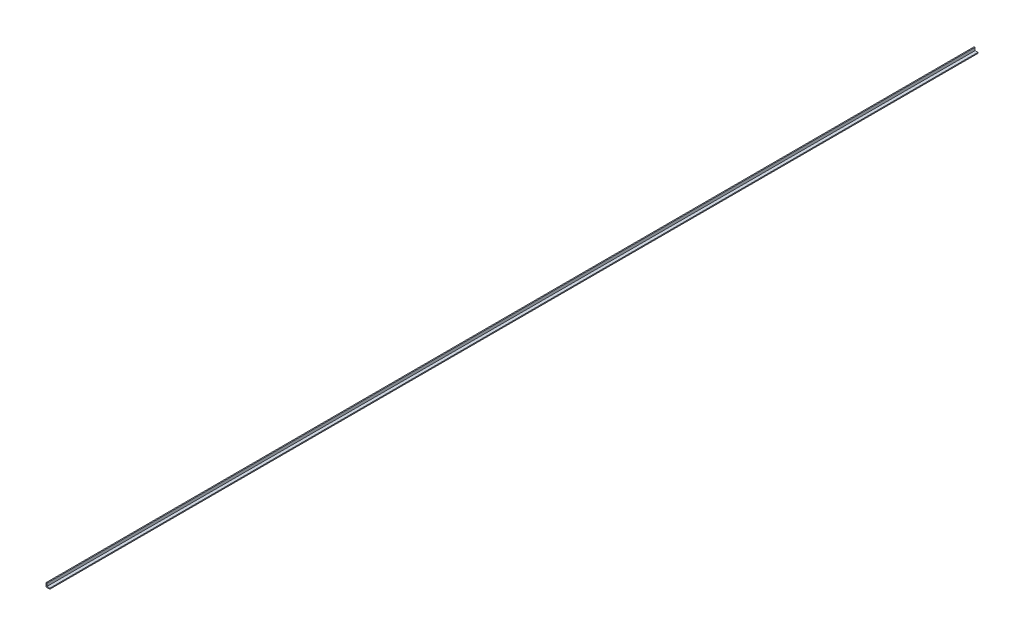
ISO-10303-21;
HEADER;
FILE_DESCRIPTION(('STEP AP214'),'2;1');
FILE_NAME('part.step','',(''),(''),'','','');
FILE_SCHEMA(('AUTOMOTIVE_DESIGN { 1 0 10303 214 1 1 1 1 }'));
ENDSEC;
DATA;
#1=APPLICATION_CONTEXT('core data for automotive mechanical design processes');
#2=APPLICATION_PROTOCOL_DEFINITION('international standard','automotive_design',2000,#1);
#3=PRODUCT_CONTEXT('',#1,'mechanical');
#4=PRODUCT('Part','Part','',(#3));
#5=PRODUCT_RELATED_PRODUCT_CATEGORY('part','',(#4));
#6=PRODUCT_DEFINITION_FORMATION('','',#4);
#7=PRODUCT_DEFINITION_CONTEXT('part definition',#1,'design');
#8=PRODUCT_DEFINITION('design','',#6,#7);
#9=PRODUCT_DEFINITION_SHAPE('','',#8);
#10=(LENGTH_UNIT() NAMED_UNIT(*) SI_UNIT(.MILLI.,.METRE.));
#11=(NAMED_UNIT(*) PLANE_ANGLE_UNIT() SI_UNIT($,.RADIAN.));
#12=(NAMED_UNIT(*) SI_UNIT($,.STERADIAN.) SOLID_ANGLE_UNIT());
#13=UNCERTAINTY_MEASURE_WITH_UNIT(LENGTH_MEASURE(1.E-05),#10,'distance_accuracy_value','');
#14=(GEOMETRIC_REPRESENTATION_CONTEXT(3) GLOBAL_UNCERTAINTY_ASSIGNED_CONTEXT((#13)) GLOBAL_UNIT_ASSIGNED_CONTEXT((#10,
#11,#12)) REPRESENTATION_CONTEXT('',''));
#15=CARTESIAN_POINT('',(0.,0.,0.));
#16=DIRECTION('',(0.,0.,1.));
#17=DIRECTION('',(1.,0.,0.));
#18=AXIS2_PLACEMENT_3D('',#15,#16,#17);
#19=CARTESIAN_POINT('',(6.35,25.4,-6100.));
#20=DIRECTION('',(0.,1.,0.));
#21=DIRECTION('',(0.,0.,1.));
#22=AXIS2_PLACEMENT_3D('',#19,#20,#21);
#23=PLANE('',#22);
#24=DIRECTION('',(-1.,0.,0.));
#25=VECTOR('',#24,1.);
#26=CARTESIAN_POINT('',(6.35,25.4,0.));
#27=LINE('',#26,#25);
#28=CARTESIAN_POINT('',(6.35,25.4,0.));
#29=VERTEX_POINT('',#28);
#30=CARTESIAN_POINT('',(0.,25.4,0.));
#31=VERTEX_POINT('',#30);
#32=EDGE_CURVE('E118',#29,#31,#27,.T.);
#33=ORIENTED_EDGE('',*,*,#32,.F.);
#34=DIRECTION('',(0.,0.,1.));
#35=VECTOR('',#34,1.);
#36=CARTESIAN_POINT('',(6.35,25.4,-6100.));
#37=LINE('',#36,#35);
#38=CARTESIAN_POINT('',(6.35,25.4,-6100.));
#39=VERTEX_POINT('',#38);
#40=EDGE_CURVE('E11',#39,#29,#37,.T.);
#41=ORIENTED_EDGE('',*,*,#40,.F.);
#42=DIRECTION('',(-1.,0.,0.));
#43=VECTOR('',#42,1.);
#44=CARTESIAN_POINT('',(6.35,25.4,-6100.));
#45=LINE('',#44,#43);
#46=CARTESIAN_POINT('',(0.,25.4,-6100.));
#47=VERTEX_POINT('',#46);
#48=EDGE_CURVE('E132',#39,#47,#45,.T.);
#49=ORIENTED_EDGE('',*,*,#48,.T.);
#50=DIRECTION('',(0.,0.,1.));
#51=VECTOR('',#50,1.);
#52=CARTESIAN_POINT('',(0.,25.4,-6100.));
#53=LINE('',#52,#51);
#54=EDGE_CURVE('E36',#47,#31,#53,.T.);
#55=ORIENTED_EDGE('',*,*,#54,.T.);
#56=EDGE_LOOP('',(#33,#41,#49,#55));
#57=FACE_BOUND('',#56,.T.);
#58=ADVANCED_FACE('F33',(#57),#23,.T.);
#59=CARTESIAN_POINT('',(6.35,6.35,-6100.));
#60=DIRECTION('',(1.,0.,0.));
#61=DIRECTION('',(0.,1.,0.));
#62=AXIS2_PLACEMENT_3D('',#59,#60,#61);
#63=PLANE('',#62);
#64=DIRECTION('',(0.,1.,0.));
#65=VECTOR('',#64,1.);
#66=CARTESIAN_POINT('',(6.35,6.35,0.));
#67=LINE('',#66,#65);
#68=CARTESIAN_POINT('',(6.35,6.35,0.));
#69=VERTEX_POINT('',#68);
#70=EDGE_CURVE('E130',#69,#29,#67,.T.);
#71=ORIENTED_EDGE('',*,*,#70,.F.);
#72=DIRECTION('',(0.,0.,1.));
#73=VECTOR('',#72,1.);
#74=CARTESIAN_POINT('',(6.35,6.35,-6100.));
#75=LINE('',#74,#73);
#76=CARTESIAN_POINT('',(6.35,6.35,-6100.));
#77=VERTEX_POINT('',#76);
#78=EDGE_CURVE('E42',#77,#69,#75,.T.);
#79=ORIENTED_EDGE('',*,*,#78,.F.);
#80=DIRECTION('',(0.,1.,0.));
#81=VECTOR('',#80,1.);
#82=CARTESIAN_POINT('',(6.35,6.35,-6100.));
#83=LINE('',#82,#81);
#84=EDGE_CURVE('E108',#77,#39,#83,.T.);
#85=ORIENTED_EDGE('',*,*,#84,.T.);
#86=ORIENTED_EDGE('',*,*,#40,.T.);
#87=EDGE_LOOP('',(#71,#79,#85,#86));
#88=FACE_BOUND('',#87,.T.);
#89=ADVANCED_FACE('F140',(#88),#63,.T.);
#90=CARTESIAN_POINT('',(25.4,6.35,-6100.));
#91=DIRECTION('',(0.,1.,0.));
#92=DIRECTION('',(-1.,0.,0.));
#93=AXIS2_PLACEMENT_3D('',#90,#91,#92);
#94=PLANE('',#93);
#95=DIRECTION('',(-1.,0.,0.));
#96=VECTOR('',#95,1.);
#97=CARTESIAN_POINT('',(25.4,6.35,0.));
#98=LINE('',#97,#96);
#99=CARTESIAN_POINT('',(25.4,6.35,0.));
#100=VERTEX_POINT('',#99);
#101=EDGE_CURVE('E95',#100,#69,#98,.T.);
#102=ORIENTED_EDGE('',*,*,#101,.F.);
#103=DIRECTION('',(0.,0.,1.));
#104=VECTOR('',#103,1.);
#105=CARTESIAN_POINT('',(25.4,6.35,-6100.));
#106=LINE('',#105,#104);
#107=CARTESIAN_POINT('',(25.4,6.35,-6100.));
#108=VERTEX_POINT('',#107);
#109=EDGE_CURVE('E90',#108,#100,#106,.T.);
#110=ORIENTED_EDGE('',*,*,#109,.F.);
#111=DIRECTION('',(-1.,0.,0.));
#112=VECTOR('',#111,1.);
#113=CARTESIAN_POINT('',(25.4,6.35,-6100.));
#114=LINE('',#113,#112);
#115=EDGE_CURVE('E93',#108,#77,#114,.T.);
#116=ORIENTED_EDGE('',*,*,#115,.T.);
#117=ORIENTED_EDGE('',*,*,#78,.T.);
#118=EDGE_LOOP('',(#102,#110,#116,#117));
#119=FACE_BOUND('',#118,.T.);
#120=ADVANCED_FACE('F92',(#119),#94,.T.);
#121=CARTESIAN_POINT('',(25.4,0.,-6100.));
#122=DIRECTION('',(1.,0.,0.));
#123=DIRECTION('',(0.,0.,-1.));
#124=AXIS2_PLACEMENT_3D('',#121,#122,#123);
#125=PLANE('',#124);
#126=DIRECTION('',(0.,1.,0.));
#127=VECTOR('',#126,1.);
#128=CARTESIAN_POINT('',(25.4,0.,0.));
#129=LINE('',#128,#127);
#130=CARTESIAN_POINT('',(25.4,0.,0.));
#131=VERTEX_POINT('',#130);
#132=EDGE_CURVE('E127',#131,#100,#129,.T.);
#133=ORIENTED_EDGE('',*,*,#132,.F.);
#134=DIRECTION('',(0.,0.,1.));
#135=VECTOR('',#134,1.);
#136=CARTESIAN_POINT('',(25.4,0.,-6100.));
#137=LINE('',#136,#135);
#138=CARTESIAN_POINT('',(25.4,0.,-6100.));
#139=VERTEX_POINT('',#138);
#140=EDGE_CURVE('E100',#139,#131,#137,.T.);
#141=ORIENTED_EDGE('',*,*,#140,.F.);
#142=DIRECTION('',(0.,1.,0.));
#143=VECTOR('',#142,1.);
#144=CARTESIAN_POINT('',(25.4,0.,-6100.));
#145=LINE('',#144,#143);
#146=EDGE_CURVE('E106',#139,#108,#145,.T.);
#147=ORIENTED_EDGE('',*,*,#146,.T.);
#148=ORIENTED_EDGE('',*,*,#109,.T.);
#149=EDGE_LOOP('',(#133,#141,#147,#148));
#150=FACE_BOUND('',#149,.T.);
#151=ADVANCED_FACE('F110',(#150),#125,.T.);
#152=CARTESIAN_POINT('',(0.,0.,-6100.));
#153=DIRECTION('',(0.,-1.,0.));
#154=DIRECTION('',(0.,0.,-1.));
#155=AXIS2_PLACEMENT_3D('',#152,#153,#154);
#156=PLANE('',#155);
#157=DIRECTION('',(1.,0.,0.));
#158=VECTOR('',#157,1.);
#159=CARTESIAN_POINT('',(0.,0.,0.));
#160=LINE('',#159,#158);
#161=CARTESIAN_POINT('',(0.,0.,0.));
#162=VERTEX_POINT('',#161);
#163=EDGE_CURVE('E124',#162,#131,#160,.T.);
#164=ORIENTED_EDGE('',*,*,#163,.F.);
#165=DIRECTION('',(0.,0.,1.));
#166=VECTOR('',#165,1.);
#167=CARTESIAN_POINT('',(0.,0.,-6100.));
#168=LINE('',#167,#166);
#169=CARTESIAN_POINT('',(0.,0.,-6100.));
#170=VERTEX_POINT('',#169);
#171=EDGE_CURVE('E135',#170,#162,#168,.T.);
#172=ORIENTED_EDGE('',*,*,#171,.F.);
#173=DIRECTION('',(1.,0.,0.));
#174=VECTOR('',#173,1.);
#175=CARTESIAN_POINT('',(0.,0.,-6100.));
#176=LINE('',#175,#174);
#177=EDGE_CURVE('E111',#170,#139,#176,.T.);
#178=ORIENTED_EDGE('',*,*,#177,.T.);
#179=ORIENTED_EDGE('',*,*,#140,.T.);
#180=EDGE_LOOP('',(#164,#172,#178,#179));
#181=FACE_BOUND('',#180,.T.);
#182=ADVANCED_FACE('F153',(#181),#156,.T.);
#183=CARTESIAN_POINT('',(0.,25.4,-6100.));
#184=DIRECTION('',(-1.,0.,0.));
#185=DIRECTION('',(0.,-1.,0.));
#186=AXIS2_PLACEMENT_3D('',#183,#184,#185);
#187=PLANE('',#186);
#188=DIRECTION('',(0.,-1.,0.));
#189=VECTOR('',#188,1.);
#190=CARTESIAN_POINT('',(0.,25.4,0.));
#191=LINE('',#190,#189);
#192=EDGE_CURVE('E121',#31,#162,#191,.T.);
#193=ORIENTED_EDGE('',*,*,#192,.F.);
#194=ORIENTED_EDGE('',*,*,#54,.F.);
#195=DIRECTION('',(0.,-1.,0.));
#196=VECTOR('',#195,1.);
#197=CARTESIAN_POINT('',(0.,25.4,-6100.));
#198=LINE('',#197,#196);
#199=EDGE_CURVE('E113',#47,#170,#198,.T.);
#200=ORIENTED_EDGE('',*,*,#199,.T.);
#201=ORIENTED_EDGE('',*,*,#171,.T.);
#202=EDGE_LOOP('',(#193,#194,#200,#201));
#203=FACE_BOUND('',#202,.T.);
#204=ADVANCED_FACE('F137',(#203),#187,.T.);
#205=CARTESIAN_POINT('',(0.,0.,-6100.));
#206=DIRECTION('',(0.,0.,1.));
#207=DIRECTION('',(1.,0.,0.));
#208=AXIS2_PLACEMENT_3D('',#205,#206,#207);
#209=PLANE('',#208);
#210=ORIENTED_EDGE('',*,*,#48,.F.);
#211=ORIENTED_EDGE('',*,*,#84,.F.);
#212=ORIENTED_EDGE('',*,*,#115,.F.);
#213=ORIENTED_EDGE('',*,*,#146,.F.);
#214=ORIENTED_EDGE('',*,*,#177,.F.);
#215=ORIENTED_EDGE('',*,*,#199,.F.);
#216=EDGE_LOOP('',(#210,#211,#212,#213,#214,#215));
#217=FACE_BOUND('',#216,.T.);
#218=ADVANCED_FACE('F104',(#217),#209,.F.);
#219=CARTESIAN_POINT('',(0.,0.,0.));
#220=DIRECTION('',(0.,0.,1.));
#221=DIRECTION('',(1.,0.,0.));
#222=AXIS2_PLACEMENT_3D('',#219,#220,#221);
#223=PLANE('',#222);
#224=ORIENTED_EDGE('',*,*,#32,.T.);
#225=ORIENTED_EDGE('',*,*,#192,.T.);
#226=ORIENTED_EDGE('',*,*,#163,.T.);
#227=ORIENTED_EDGE('',*,*,#132,.T.);
#228=ORIENTED_EDGE('',*,*,#101,.T.);
#229=ORIENTED_EDGE('',*,*,#70,.T.);
#230=EDGE_LOOP('',(#224,#225,#226,#227,#228,#229));
#231=FACE_BOUND('',#230,.T.);
#232=ADVANCED_FACE('F139',(#231),#223,.T.);
#233=CLOSED_SHELL('',(#58,#89,#120,#151,#182,#204,#218,#232));
#234=MANIFOLD_SOLID_BREP('B2',#233);
#235=ADVANCED_BREP_SHAPE_REPRESENTATION('',(#18,#234),#14);
#236=SHAPE_DEFINITION_REPRESENTATION(#9,#235);
ENDSEC;
END-ISO-10303-21;
